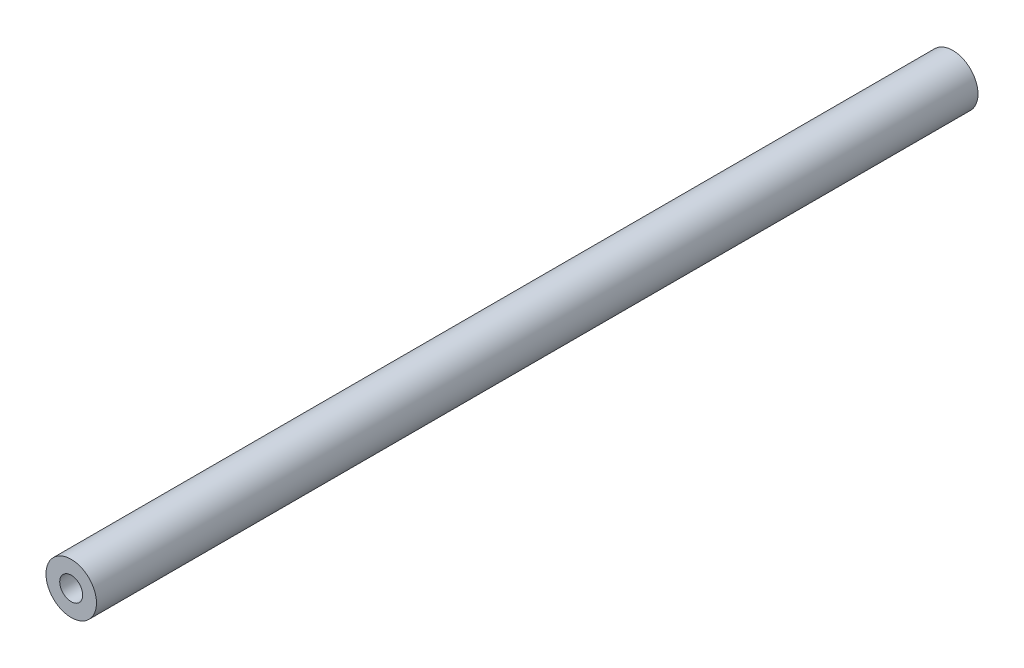
ISO-10303-21;
HEADER;
FILE_DESCRIPTION(('STEP AP214'),'2;1');
FILE_NAME('part.step','',(''),(''),'','','');
FILE_SCHEMA(('AUTOMOTIVE_DESIGN { 1 0 10303 214 1 1 1 1 }'));
ENDSEC;
DATA;
#1=APPLICATION_CONTEXT('core data for automotive mechanical design processes');
#2=APPLICATION_PROTOCOL_DEFINITION('international standard','automotive_design',2000,#1);
#3=PRODUCT_CONTEXT('',#1,'mechanical');
#4=PRODUCT('Part','Part','',(#3));
#5=PRODUCT_RELATED_PRODUCT_CATEGORY('part','',(#4));
#6=PRODUCT_DEFINITION_FORMATION('','',#4);
#7=PRODUCT_DEFINITION_CONTEXT('part definition',#1,'design');
#8=PRODUCT_DEFINITION('design','',#6,#7);
#9=PRODUCT_DEFINITION_SHAPE('','',#8);
#10=(LENGTH_UNIT() NAMED_UNIT(*) SI_UNIT(.MILLI.,.METRE.));
#11=(NAMED_UNIT(*) PLANE_ANGLE_UNIT() SI_UNIT($,.RADIAN.));
#12=(NAMED_UNIT(*) SI_UNIT($,.STERADIAN.) SOLID_ANGLE_UNIT());
#13=UNCERTAINTY_MEASURE_WITH_UNIT(LENGTH_MEASURE(1.E-05),#10,'distance_accuracy_value','');
#14=(GEOMETRIC_REPRESENTATION_CONTEXT(3) GLOBAL_UNCERTAINTY_ASSIGNED_CONTEXT((#13)) GLOBAL_UNIT_ASSIGNED_CONTEXT((#10,
#11,#12)) REPRESENTATION_CONTEXT('',''));
#15=CARTESIAN_POINT('',(0.,0.,0.));
#16=DIRECTION('',(0.,0.,1.));
#17=DIRECTION('',(1.,0.,0.));
#18=AXIS2_PLACEMENT_3D('',#15,#16,#17);
#19=CARTESIAN_POINT('',(0.,0.,96.));
#20=DIRECTION('',(0.,0.,1.));
#21=DIRECTION('',(1.,0.,0.));
#22=AXIS2_PLACEMENT_3D('',#19,#20,#21);
#23=PLANE('',#22);
#24=CARTESIAN_POINT('',(0.,0.,96.));
#25=DIRECTION('',(0.,0.,1.));
#26=DIRECTION('',(1.,0.,0.));
#27=AXIS2_PLACEMENT_3D('',#24,#25,#26);
#28=CIRCLE('',#27,2.75);
#29=CARTESIAN_POINT('',(2.75,0.,96.));
#30=VERTEX_POINT('',#29);
#31=EDGE_CURVE('E10',#30,#30,#28,.T.);
#32=ORIENTED_EDGE('',*,*,#31,.T.);
#33=EDGE_LOOP('',(#32));
#34=FACE_BOUND('',#33,.T.);
#35=CARTESIAN_POINT('',(0.,0.,96.));
#36=DIRECTION('',(0.,0.,1.));
#37=DIRECTION('',(1.,0.,0.));
#38=AXIS2_PLACEMENT_3D('',#35,#36,#37);
#39=CIRCLE('',#38,1.25);
#40=CARTESIAN_POINT('',(1.25,0.,96.));
#41=VERTEX_POINT('',#40);
#42=EDGE_CURVE('E50',#41,#41,#39,.T.);
#43=ORIENTED_EDGE('',*,*,#42,.F.);
#44=EDGE_LOOP('',(#43));
#45=FACE_BOUND('',#44,.T.);
#46=ADVANCED_FACE('F37',(#34,#45),#23,.T.);
#47=CARTESIAN_POINT('',(0.,0.,0.));
#48=DIRECTION('',(0.,0.,1.));
#49=DIRECTION('',(1.,0.,0.));
#50=AXIS2_PLACEMENT_3D('',#47,#48,#49);
#51=PLANE('',#50);
#52=CARTESIAN_POINT('',(0.,0.,0.));
#53=DIRECTION('',(0.,0.,1.));
#54=DIRECTION('',(1.,0.,0.));
#55=AXIS2_PLACEMENT_3D('',#52,#53,#54);
#56=CIRCLE('',#55,2.75);
#57=CARTESIAN_POINT('',(2.75,0.,0.));
#58=VERTEX_POINT('',#57);
#59=EDGE_CURVE('E41',#58,#58,#56,.T.);
#60=ORIENTED_EDGE('',*,*,#59,.F.);
#61=EDGE_LOOP('',(#60));
#62=FACE_BOUND('',#61,.T.);
#63=CARTESIAN_POINT('',(0.,0.,0.));
#64=DIRECTION('',(0.,0.,1.));
#65=DIRECTION('',(1.,0.,0.));
#66=AXIS2_PLACEMENT_3D('',#63,#64,#65);
#67=CIRCLE('',#66,1.25);
#68=CARTESIAN_POINT('',(1.25,0.,0.));
#69=VERTEX_POINT('',#68);
#70=EDGE_CURVE('E52',#69,#69,#67,.T.);
#71=ORIENTED_EDGE('',*,*,#70,.T.);
#72=EDGE_LOOP('',(#71));
#73=FACE_BOUND('',#72,.T.);
#74=ADVANCED_FACE('F64',(#62,#73),#51,.F.);
#75=CARTESIAN_POINT('',(0.,0.,96.));
#76=DIRECTION('',(0.,0.,-1.));
#77=DIRECTION('',(-1.,0.,0.));
#78=AXIS2_PLACEMENT_3D('',#75,#76,#77);
#79=CYLINDRICAL_SURFACE('',#78,2.75);
#80=ORIENTED_EDGE('',*,*,#31,.F.);
#81=EDGE_LOOP('',(#80));
#82=FACE_BOUND('',#81,.T.);
#83=ORIENTED_EDGE('',*,*,#59,.T.);
#84=EDGE_LOOP('',(#83));
#85=FACE_BOUND('',#84,.T.);
#86=ADVANCED_FACE('F39',(#82,#85),#79,.T.);
#87=CARTESIAN_POINT('',(0.,0.,96.));
#88=DIRECTION('',(0.,0.,-1.));
#89=DIRECTION('',(-1.,0.,0.));
#90=AXIS2_PLACEMENT_3D('',#87,#88,#89);
#91=CYLINDRICAL_SURFACE('',#90,1.25);
#92=ORIENTED_EDGE('',*,*,#42,.T.);
#93=EDGE_LOOP('',(#92));
#94=FACE_BOUND('',#93,.T.);
#95=ORIENTED_EDGE('',*,*,#70,.F.);
#96=EDGE_LOOP('',(#95));
#97=FACE_BOUND('',#96,.T.);
#98=ADVANCED_FACE('F60',(#94,#97),#91,.F.);
#99=CLOSED_SHELL('',(#46,#74,#86,#98));
#100=MANIFOLD_SOLID_BREP('B2',#99);
#101=ADVANCED_BREP_SHAPE_REPRESENTATION('',(#18,#100),#14);
#102=SHAPE_DEFINITION_REPRESENTATION(#9,#101);
ENDSEC;
END-ISO-10303-21;
